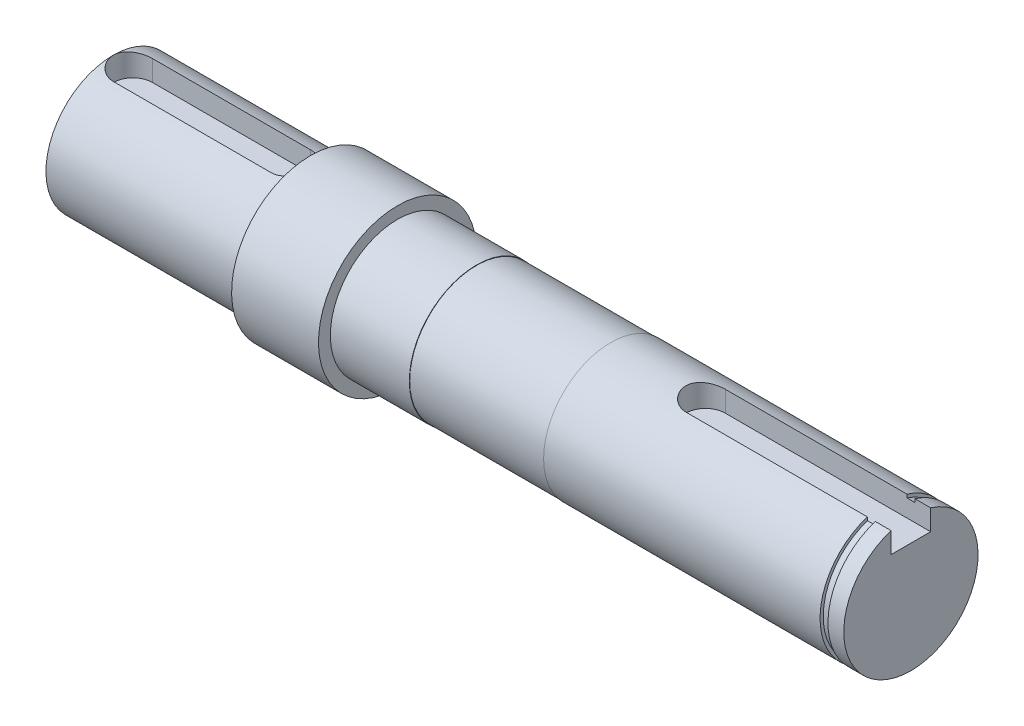
ISO-10303-21;
HEADER;
FILE_DESCRIPTION(('STEP AP214'),'2;1');
FILE_NAME('part.step','',(''),(''),'','','');
FILE_SCHEMA(('AUTOMOTIVE_DESIGN { 1 0 10303 214 1 1 1 1 }'));
ENDSEC;
DATA;
#1=APPLICATION_CONTEXT('core data for automotive mechanical design processes');
#2=APPLICATION_PROTOCOL_DEFINITION('international standard','automotive_design',2000,#1);
#3=PRODUCT_CONTEXT('',#1,'mechanical');
#4=PRODUCT('Part','Part','',(#3));
#5=PRODUCT_RELATED_PRODUCT_CATEGORY('part','',(#4));
#6=PRODUCT_DEFINITION_FORMATION('','',#4);
#7=PRODUCT_DEFINITION_CONTEXT('part definition',#1,'design');
#8=PRODUCT_DEFINITION('design','',#6,#7);
#9=PRODUCT_DEFINITION_SHAPE('','',#8);
#10=(LENGTH_UNIT() NAMED_UNIT(*) SI_UNIT(.MILLI.,.METRE.));
#11=(NAMED_UNIT(*) PLANE_ANGLE_UNIT() SI_UNIT($,.RADIAN.));
#12=(NAMED_UNIT(*) SI_UNIT($,.STERADIAN.) SOLID_ANGLE_UNIT());
#13=UNCERTAINTY_MEASURE_WITH_UNIT(LENGTH_MEASURE(1.E-05),#10,'distance_accuracy_value','');
#14=(GEOMETRIC_REPRESENTATION_CONTEXT(3) GLOBAL_UNCERTAINTY_ASSIGNED_CONTEXT((#13)) GLOBAL_UNIT_ASSIGNED_CONTEXT((#10,
#11,#12)) REPRESENTATION_CONTEXT('',''));
#15=CARTESIAN_POINT('',(0.,0.,0.));
#16=DIRECTION('',(0.,0.,1.));
#17=DIRECTION('',(1.,0.,0.));
#18=AXIS2_PLACEMENT_3D('',#15,#16,#17);
#19=CARTESIAN_POINT('',(101.,0.,0.));
#20=DIRECTION('',(1.,0.,0.));
#21=DIRECTION('',(0.,1.,0.));
#22=AXIS2_PLACEMENT_3D('',#19,#20,#21);
#23=CYLINDRICAL_SURFACE('',#22,8.49999999999998);
#24=CARTESIAN_POINT('',(36.,0.,0.));
#25=DIRECTION('',(1.,0.,0.));
#26=DIRECTION('',(0.,1.,0.));
#27=AXIS2_PLACEMENT_3D('',#24,#25,#26);
#28=CIRCLE('',#27,8.49999999999999);
#29=CARTESIAN_POINT('',(36.,8.49999999999999,0.));
#30=VERTEX_POINT('',#29);
#31=EDGE_CURVE('E277',#30,#30,#28,.T.);
#32=ORIENTED_EDGE('',*,*,#31,.T.);
#33=EDGE_LOOP('',(#32));
#34=FACE_BOUND('',#33,.T.);
#35=CARTESIAN_POINT('',(46.0000000000074,0.,0.));
#36=DIRECTION('',(-1.,0.,0.));
#37=DIRECTION('',(0.,0.,1.));
#38=AXIS2_PLACEMENT_3D('',#35,#36,#37);
#39=CIRCLE('',#38,8.49999999999998);
#40=CARTESIAN_POINT('',(46.0000000000074,0.,8.49999999999998));
#41=VERTEX_POINT('',#40);
#42=EDGE_CURVE('E358',#41,#41,#39,.T.);
#43=ORIENTED_EDGE('',*,*,#42,.T.);
#44=EDGE_LOOP('',(#43));
#45=FACE_BOUND('',#44,.T.);
#46=ADVANCED_FACE('F33',(#34,#45),#23,.T.);
#47=CARTESIAN_POINT('',(0.,0.,0.));
#48=DIRECTION('',(-1.,0.,0.));
#49=DIRECTION('',(0.,-1.,0.));
#50=AXIS2_PLACEMENT_3D('',#47,#48,#49);
#51=PLANE('',#50);
#52=CARTESIAN_POINT('',(0.,0.,0.));
#53=DIRECTION('',(1.,0.,0.));
#54=DIRECTION('',(0.,1.,0.));
#55=AXIS2_PLACEMENT_3D('',#52,#53,#54);
#56=CIRCLE('',#55,8.49999999999999);
#57=CARTESIAN_POINT('',(0.,8.49999999999999,0.));
#58=VERTEX_POINT('',#57);
#59=EDGE_CURVE('E287',#58,#58,#56,.T.);
#60=ORIENTED_EDGE('',*,*,#59,.F.);
#61=EDGE_LOOP('',(#60));
#62=FACE_BOUND('',#61,.T.);
#63=ADVANCED_FACE('F35',(#62),#51,.T.);
#64=CARTESIAN_POINT('',(101.,0.,0.));
#65=DIRECTION('',(1.,0.,0.));
#66=DIRECTION('',(0.,1.,0.));
#67=AXIS2_PLACEMENT_3D('',#64,#65,#66);
#68=CYLINDRICAL_SURFACE('',#67,8.49999999999999);
#69=CARTESIAN_POINT('',(2.51,8.12403840463595,-2.5));
#70=CARTESIAN_POINT('',(2.44132012598351,8.12402906918786,-2.50000849482375));
#71=CARTESIAN_POINT('',(2.37264564496574,8.12490911076692,-2.49717000278527));
#72=CARTESIAN_POINT('',(2.23581945584985,8.12837858671624,-2.48586511968106));
#73=CARTESIAN_POINT('',(2.16766763730745,8.13096764928693,-2.47739995270244));
#74=CARTESIAN_POINT('',(2.03253481475384,8.13777747849976,-2.45493539721691));
#75=CARTESIAN_POINT('',(1.96555134368311,8.14199421689238,-2.44094966934028));
#76=CARTESIAN_POINT('',(1.83307387750925,8.15192355487622,-2.40758038109888));
#77=CARTESIAN_POINT('',(1.76757991899812,8.15763619117327,-2.38819668828));
#78=CARTESIAN_POINT('',(1.57405334228369,8.17677139859333,-2.32218333516284));
#79=CARTESIAN_POINT('',(1.44880885562689,8.19220032894025,-2.26766331260792));
#80=CARTESIAN_POINT('',(1.20924749977114,8.22665400749431,-2.13928827038699));
#81=CARTESIAN_POINT('',(1.09493547462655,8.24568033865687,-2.06542473351158));
#82=CARTESIAN_POINT('',(0.876977246358632,8.28582980304435,-1.89805567552886));
#83=CARTESIAN_POINT('',(0.773708544242656,8.3069960693274,-1.80406793699746));
#84=CARTESIAN_POINT('',(0.58414876913239,8.34867230677749,-1.60015164255654));
#85=CARTESIAN_POINT('',(0.497860541847804,8.36918216745791,-1.49022042007658));
#86=CARTESIAN_POINT('',(0.343070185536935,8.4077250943906,-1.25484557022574));
#87=CARTESIAN_POINT('',(0.274954141378952,8.42570106520509,-1.12913784642324));
#88=CARTESIAN_POINT('',(0.160978008424449,8.45664705558545,-0.867439712870041));
#89=CARTESIAN_POINT('',(0.115112355001258,8.46961832661637,-0.731451883926503));
#90=CARTESIAN_POINT('',(0.0481874024191118,8.48878775104764,-0.45702543604251));
#91=CARTESIAN_POINT('',(0.026479434076655,8.49516267663222,-0.318757581047488));
#92=CARTESIAN_POINT('',(0.00643683305777085,8.50104290465191,-0.0404023337326061));
#93=CARTESIAN_POINT('',(0.00809796422748242,8.50054945212902,0.0996847242177982));
#94=CARTESIAN_POINT('',(0.0343079273842703,8.49287404903276,0.373152065700697));
#95=CARTESIAN_POINT('',(0.0581541875525614,8.48589741931877,0.506606351501286));
#96=CARTESIAN_POINT('',(0.126911871627669,8.46628787386657,0.767526211609399));
#97=CARTESIAN_POINT('',(0.171824383512801,8.45365466599276,0.894991476236481));
#98=CARTESIAN_POINT('',(0.281927116913897,8.4238636719765,1.14201050505989));
#99=CARTESIAN_POINT('',(0.347342099128687,8.40665607251672,1.26145783196649));
#100=CARTESIAN_POINT('',(0.496415594932422,8.36954730631604,1.48790576816497));
#101=CARTESIAN_POINT('',(0.580078038110117,8.34964555974156,1.59490368885599));
#102=CARTESIAN_POINT('',(0.766920813166765,8.30841337666869,1.79760092163623));
#103=CARTESIAN_POINT('',(0.87070899040578,8.28705732485782,1.89273539157049));
#104=CARTESIAN_POINT('',(1.09300405690464,8.24596689824959,2.06442395091057));
#105=CARTESIAN_POINT('',(1.21151517138103,8.22623299169097,2.14097268784054));
#106=CARTESIAN_POINT('',(1.46135178976552,8.19049726651392,2.27388499803613));
#107=CARTESIAN_POINT('',(1.5927874583343,8.17453234339791,2.33005169701786));
#108=CARTESIAN_POINT('',(1.86375726830082,8.14859211524142,2.41922275200858));
#109=CARTESIAN_POINT('',(2.00327871917307,8.13860768891973,2.45226239378342));
#110=CARTESIAN_POINT('',(2.20507757930823,8.12953164409689,2.48209216527632));
#111=CARTESIAN_POINT('',(2.26589533912244,8.12747604590248,2.48880708529662));
#112=CARTESIAN_POINT('',(2.38779853307323,8.12472934803225,2.49775684694221));
#113=CARTESIAN_POINT('',(2.44888342988087,8.12403620932029,2.49999838344215));
#114=CARTESIAN_POINT('',(2.51,8.12403840463595,2.5));
#115=B_SPLINE_CURVE_WITH_KNOTS('',3,(#69,#70,#71,#72,#73,#74,#75,#76,#77,#78,#79,#80,#81,#82,
#83,#84,#85,#86,#87,#88,#89,#90,#91,#92,#93,#94,#95,#96,#97,#98,#99,#100,#101,#102,#103,#104,
#105,#106,#107,#108,#109,#110,#111,#112,#113,#114),.UNSPECIFIED.,.F.,.F.,(4,2,2,2,2,2,2,2,2,2,2,
2,2,2,2,2,2,2,2,2,2,2,4),(0.,0.205966154303658,0.411887515184554,0.617302486138781,
0.822722497965401,1.23305966556148,1.64357781480005,2.0653304967558,2.48715379896953,
2.91733102657664,3.3474006151165,3.76562050724646,4.18376458896797,4.58910158908383,
4.9944595253604,5.40442657694559,5.81448200221468,6.2397161669572,6.66507264934228,
7.09443475825322,7.52314033790765,7.70665727258006,7.88989934885714),.UNSPECIFIED.);
#116=CARTESIAN_POINT('',(2.51,8.12403840463595,-2.5));
#117=VERTEX_POINT('',#116);
#118=CARTESIAN_POINT('',(2.51,8.12403840463596,2.5));
#119=VERTEX_POINT('',#118);
#120=EDGE_CURVE('E142',#117,#119,#115,.T.);
#121=ORIENTED_EDGE('',*,*,#120,.F.);
#122=DIRECTION('',(1.,0.,0.));
#123=VECTOR('',#122,1.);
#124=CARTESIAN_POINT('',(101.,8.12403840463596,-2.50000000000001));
#125=LINE('',#124,#123);
#126=CARTESIAN_POINT('',(22.51,8.12403840463595,-2.5));
#127=VERTEX_POINT('',#126);
#128=EDGE_CURVE('E12',#127,#117,#125,.F.);
#129=ORIENTED_EDGE('',*,*,#128,.F.);
#130=CARTESIAN_POINT('',(25.,8.49706419888657,-0.223383079036948));
#131=CARTESIAN_POINT('',(24.993813347442,8.49525655884987,-0.292435308228331));
#132=CARTESIAN_POINT('',(24.9847409070689,8.49259893892862,-0.361199395677494));
#133=CARTESIAN_POINT('',(24.9609453799739,8.48569265386917,-0.497645530334624));
#134=CARTESIAN_POINT('',(24.9462236431494,8.48144436882577,-0.565327832013578));
#135=CARTESIAN_POINT('',(24.9112875125512,8.47147615101255,-0.698984565839865));
#136=CARTESIAN_POINT('',(24.8910857996503,8.46575961742932,-0.764962560481731));
#137=CARTESIAN_POINT('',(24.8453599091532,8.45301280034375,-0.894898842268685));
#138=CARTESIAN_POINT('',(24.8198355514473,8.44598247238555,-0.958857060983446));
#139=CARTESIAN_POINT('',(24.7355849608704,8.42319910103025,-1.14699950029637));
#140=CARTESIAN_POINT('',(24.6691353557341,8.40573995109053,-1.26762564306889));
#141=CARTESIAN_POINT('',(24.5176481407656,8.3681112680584,-1.49605221867256));
#142=CARTESIAN_POINT('',(24.4326031130196,8.3479406545745,-1.60384750656001));
#143=CARTESIAN_POINT('',(24.2436743792781,8.30643895546526,-1.8066725358398));
#144=CARTESIAN_POINT('',(24.1393573652561,8.28509132530584,-1.901296237207));
#145=CARTESIAN_POINT('',(23.9160815364517,8.24409163636891,-2.07187764207679));
#146=CARTESIAN_POINT('',(23.7971181555461,8.22444010962984,-2.14782950225405));
#147=CARTESIAN_POINT('',(23.5465418299409,8.18895060432059,-2.27942765429356));
#148=CARTESIAN_POINT('',(23.4148263351885,8.17314788281347,-2.33488845959448));
#149=CARTESIAN_POINT('',(23.1434328092201,8.14758251983388,-2.42260657469438));
#150=CARTESIAN_POINT('',(23.0037678986843,8.13781022366502,-2.45490098737235));
#151=CARTESIAN_POINT('',(22.8040241883731,8.12914567218984,-2.48335360976332));
#152=CARTESIAN_POINT('',(22.7453656804734,8.12723415571825,-2.489595839628));
#153=CARTESIAN_POINT('',(22.6278145030744,8.12468069216272,-2.49791494108419));
#154=CARTESIAN_POINT('',(22.5689223128896,8.12403685709001,-2.49999800708497));
#155=CARTESIAN_POINT('',(22.51,8.12403840463596,-2.5));
#156=B_SPLINE_CURVE_WITH_KNOTS('',3,(#130,#131,#132,#133,#134,#135,#136,#137,#138,#139,#140,
#141,#142,#143,#144,#145,#146,#147,#148,#149,#150,#151,#152,#153,#154,#155),.UNSPECIFIED.,.F.,
.F.,(4,2,2,2,2,2,2,2,2,2,2,2,4),(0.,0.207980442842485,0.415911219741289,0.623364882068589,
0.830825565434457,1.24521191947858,1.65976387925486,2.08512275114555,2.51061456949985,
2.93986871891648,3.36843383829658,3.54536451057105,3.72203147576733),.UNSPECIFIED.);
#157=CARTESIAN_POINT('',(25.,8.49706419888657,-0.223383079036861));
#158=VERTEX_POINT('',#157);
#159=EDGE_CURVE('E169',#158,#127,#156,.T.);
#160=ORIENTED_EDGE('',*,*,#159,.F.);
#161=CARTESIAN_POINT('',(25.,0.,0.));
#162=DIRECTION('',(1.,0.,0.));
#163=DIRECTION('',(0.,1.,0.));
#164=AXIS2_PLACEMENT_3D('',#161,#162,#163);
#165=CIRCLE('',#164,8.49999999999999);
#166=CARTESIAN_POINT('',(25.,8.49706419888657,0.223383079036856));
#167=VERTEX_POINT('',#166);
#168=EDGE_CURVE('E218',#167,#158,#165,.T.);
#169=ORIENTED_EDGE('',*,*,#168,.F.);
#170=CARTESIAN_POINT('',(22.51,8.12403840463595,2.5));
#171=CARTESIAN_POINT('',(22.5786805370385,8.12402906877925,2.50000849609303));
#172=CARTESIAN_POINT('',(22.6473556816249,8.12490912756119,2.49716994858));
#173=CARTESIAN_POINT('',(22.7841831821002,8.12837867030531,2.48586484646458));
#174=CARTESIAN_POINT('',(22.8523356484438,8.13096778243671,2.47739951605241));
#175=CARTESIAN_POINT('',(22.9874684336137,8.13777767460837,2.45493474787382));
#176=CARTESIAN_POINT('',(23.0544512388449,8.1419943948615,2.44094907769413));
#177=CARTESIAN_POINT('',(23.1869273947816,8.15192366586084,2.40758000169047));
#178=CARTESIAN_POINT('',(23.2524207089904,8.15763625321725,2.38819646375707));
#179=CARTESIAN_POINT('',(23.4459484121886,8.17677157216759,2.32218275729729));
#180=CARTESIAN_POINT('',(23.5711945448026,8.19220074873478,2.26766194343456));
#181=CARTESIAN_POINT('',(23.8107556482421,8.22665452984702,2.13928612954425));
#182=CARTESIAN_POINT('',(23.9250660743792,8.24568061951481,2.06542313849218));
#183=CARTESIAN_POINT('',(24.1430105207039,8.28582755425194,1.89806548574551));
#184=CARTESIAN_POINT('',(24.2462684264297,8.30699137209334,1.80409043225915));
#185=CARTESIAN_POINT('',(24.4358324309312,8.34866780739879,1.60017414536475));
#186=CARTESIAN_POINT('',(24.5221319466521,8.36918016939478,1.49022674036273));
#187=CARTESIAN_POINT('',(24.6769787262261,8.4077374037511,1.2547764003125));
#188=CARTESIAN_POINT('',(24.7451291516515,8.42572359267612,1.12900252450636));
#189=CARTESIAN_POINT('',(24.8590846344064,8.45666415648478,0.867239980267896));
#190=CARTESIAN_POINT('',(24.9049236042065,8.46962616176902,0.731267179157219));
#191=CARTESIAN_POINT('',(24.9536019427315,8.48357271826782,0.531714661116634));
#192=CARTESIAN_POINT('',(24.9661135931956,8.48718990766301,0.47054182860288));
#193=CARTESIAN_POINT('',(24.9865199928087,8.49311851353699,0.347459353113864));
#194=CARTESIAN_POINT('',(24.9944213608226,8.49543180183031,0.285550897290376));
#195=CARTESIAN_POINT('',(25.,8.49706419888657,0.223383079036943));
#196=B_SPLINE_CURVE_WITH_KNOTS('',3,(#170,#171,#172,#173,#174,#175,#176,#177,#178,#179,#180,
#181,#182,#183,#184,#185,#186,#187,#188,#189,#190,#191,#192,#193,#194,#195),.UNSPECIFIED.,.F.,
.F.,(4,2,2,2,2,2,2,2,2,2,2,2,4),(0.,0.205968142667953,0.411891488567575,0.617304479325872,
0.822722497880503,1.23306525748042,1.64357781423138,2.06528411602704,2.48715379744468,
2.91760538291471,3.34740064100109,3.53487536146799,3.72208026275678),.UNSPECIFIED.);
#197=CARTESIAN_POINT('',(22.51,8.12403840463596,2.5));
#198=VERTEX_POINT('',#197);
#199=EDGE_CURVE('E179',#198,#167,#196,.T.);
#200=ORIENTED_EDGE('',*,*,#199,.F.);
#201=DIRECTION('',(1.,0.,0.));
#202=VECTOR('',#201,1.);
#203=CARTESIAN_POINT('',(101.,8.12403840463597,2.49999999999999));
#204=LINE('',#203,#202);
#205=EDGE_CURVE('E41',#119,#198,#204,.T.);
#206=ORIENTED_EDGE('',*,*,#205,.F.);
#207=EDGE_LOOP('',(#121,#129,#160,#169,#200,#206));
#208=FACE_BOUND('',#207,.T.);
#209=ORIENTED_EDGE('',*,*,#59,.T.);
#210=EDGE_LOOP('',(#209));
#211=FACE_BOUND('',#210,.T.);
#212=ADVANCED_FACE('F184',(#208,#211),#68,.T.);
#213=CARTESIAN_POINT('',(25.,9.99999999999999,0.));
#214=DIRECTION('',(-1.,0.,0.));
#215=DIRECTION('',(0.,-1.,0.));
#216=AXIS2_PLACEMENT_3D('',#213,#214,#215);
#217=PLANE('',#216);
#218=DIRECTION('',(0.,1.,0.));
#219=VECTOR('',#218,1.);
#220=CARTESIAN_POINT('',(25.,5.5,0.223383079036856));
#221=LINE('',#220,#219);
#222=CARTESIAN_POINT('',(25.,8.5,0.223383079036856));
#223=VERTEX_POINT('',#222);
#224=EDGE_CURVE('E209',#167,#223,#221,.T.);
#225=ORIENTED_EDGE('',*,*,#224,.F.);
#226=ORIENTED_EDGE('',*,*,#168,.T.);
#227=DIRECTION('',(0.,1.,0.));
#228=VECTOR('',#227,1.);
#229=CARTESIAN_POINT('',(25.,5.5,-0.223383079036861));
#230=LINE('',#229,#228);
#231=CARTESIAN_POINT('',(25.,8.5,-0.223383079036861));
#232=VERTEX_POINT('',#231);
#233=EDGE_CURVE('E480',#232,#158,#230,.F.);
#234=ORIENTED_EDGE('',*,*,#233,.F.);
#235=DIRECTION('',(0.,0.,1.));
#236=VECTOR('',#235,1.);
#237=CARTESIAN_POINT('',(25.,8.5,0.));
#238=LINE('',#237,#236);
#239=EDGE_CURVE('E305',#232,#223,#238,.T.);
#240=ORIENTED_EDGE('',*,*,#239,.T.);
#241=EDGE_LOOP('',(#225,#226,#234,#240));
#242=FACE_BOUND('',#241,.T.);
#243=CARTESIAN_POINT('',(25.,0.,0.));
#244=DIRECTION('',(1.,0.,0.));
#245=DIRECTION('',(0.,1.,0.));
#246=AXIS2_PLACEMENT_3D('',#243,#244,#245);
#247=CIRCLE('',#246,9.99999999999998);
#248=CARTESIAN_POINT('',(25.,9.99999999999999,0.));
#249=VERTEX_POINT('',#248);
#250=EDGE_CURVE('E283',#249,#249,#247,.T.);
#251=ORIENTED_EDGE('',*,*,#250,.F.);
#252=EDGE_LOOP('',(#251));
#253=FACE_BOUND('',#252,.T.);
#254=ADVANCED_FACE('F435',(#242,#253),#217,.T.);
#255=CARTESIAN_POINT('',(101.,0.,0.));
#256=DIRECTION('',(1.,0.,0.));
#257=DIRECTION('',(0.,1.,0.));
#258=AXIS2_PLACEMENT_3D('',#255,#256,#257);
#259=CYLINDRICAL_SURFACE('',#258,9.99999999999998);
#260=ORIENTED_EDGE('',*,*,#250,.T.);
#261=EDGE_LOOP('',(#260));
#262=FACE_BOUND('',#261,.T.);
#263=CARTESIAN_POINT('',(36.,0.,0.));
#264=DIRECTION('',(1.,0.,0.));
#265=DIRECTION('',(0.,1.,0.));
#266=AXIS2_PLACEMENT_3D('',#263,#264,#265);
#267=CIRCLE('',#266,9.99999999999998);
#268=CARTESIAN_POINT('',(36.,9.99999999999999,0.));
#269=VERTEX_POINT('',#268);
#270=EDGE_CURVE('E280',#269,#269,#267,.T.);
#271=ORIENTED_EDGE('',*,*,#270,.F.);
#272=EDGE_LOOP('',(#271));
#273=FACE_BOUND('',#272,.T.);
#274=ADVANCED_FACE('F444',(#262,#273),#259,.T.);
#275=CARTESIAN_POINT('',(36.,9.99999999999999,0.));
#276=DIRECTION('',(1.,0.,0.));
#277=DIRECTION('',(0.,1.,0.));
#278=AXIS2_PLACEMENT_3D('',#275,#276,#277);
#279=PLANE('',#278);
#280=ORIENTED_EDGE('',*,*,#270,.T.);
#281=EDGE_LOOP('',(#280));
#282=FACE_BOUND('',#281,.T.);
#283=ORIENTED_EDGE('',*,*,#31,.F.);
#284=EDGE_LOOP('',(#283));
#285=FACE_BOUND('',#284,.T.);
#286=ADVANCED_FACE('F201',(#282,#285),#279,.T.);
#287=CARTESIAN_POINT('',(2.51,5.5,0.));
#288=DIRECTION('',(0.,1.,0.));
#289=DIRECTION('',(0.,0.,1.));
#290=AXIS2_PLACEMENT_3D('',#287,#288,#289);
#291=CYLINDRICAL_SURFACE('',#290,2.5);
#292=DIRECTION('',(0.,1.,0.));
#293=VECTOR('',#292,1.);
#294=CARTESIAN_POINT('',(2.51,5.5,-2.5));
#295=LINE('',#294,#293);
#296=CARTESIAN_POINT('',(2.51,5.5,-2.5));
#297=VERTEX_POINT('',#296);
#298=EDGE_CURVE('E167',#297,#117,#295,.T.);
#299=ORIENTED_EDGE('',*,*,#298,.T.);
#300=ORIENTED_EDGE('',*,*,#120,.T.);
#301=DIRECTION('',(0.,1.,0.));
#302=VECTOR('',#301,1.);
#303=CARTESIAN_POINT('',(2.51,5.5,2.5));
#304=LINE('',#303,#302);
#305=CARTESIAN_POINT('',(2.51,5.5,2.5));
#306=VERTEX_POINT('',#305);
#307=EDGE_CURVE('E135',#306,#119,#304,.T.);
#308=ORIENTED_EDGE('',*,*,#307,.F.);
#309=CARTESIAN_POINT('',(2.51,5.5,0.));
#310=DIRECTION('',(0.,1.,0.));
#311=DIRECTION('',(0.,0.,-1.));
#312=AXIS2_PLACEMENT_3D('',#309,#310,#311);
#313=CIRCLE('',#312,2.5);
#314=EDGE_CURVE('E140',#297,#306,#313,.T.);
#315=ORIENTED_EDGE('',*,*,#314,.F.);
#316=EDGE_LOOP('',(#299,#300,#308,#315));
#317=FACE_BOUND('',#316,.T.);
#318=ADVANCED_FACE('F138',(#317),#291,.F.);
#319=CARTESIAN_POINT('',(2.51,5.5,-2.5));
#320=DIRECTION('',(0.,0.,-1.));
#321=DIRECTION('',(-1.,0.,0.));
#322=AXIS2_PLACEMENT_3D('',#319,#320,#321);
#323=PLANE('',#322);
#324=ORIENTED_EDGE('',*,*,#128,.T.);
#325=ORIENTED_EDGE('',*,*,#298,.F.);
#326=DIRECTION('',(-1.,0.,0.));
#327=VECTOR('',#326,1.);
#328=CARTESIAN_POINT('',(2.51,5.5,-2.5));
#329=LINE('',#328,#327);
#330=CARTESIAN_POINT('',(22.51,5.5,-2.5));
#331=VERTEX_POINT('',#330);
#332=EDGE_CURVE('E146',#331,#297,#329,.T.);
#333=ORIENTED_EDGE('',*,*,#332,.F.);
#334=DIRECTION('',(0.,1.,0.));
#335=VECTOR('',#334,1.);
#336=CARTESIAN_POINT('',(22.51,5.5,-2.5));
#337=LINE('',#336,#335);
#338=EDGE_CURVE('E170',#331,#127,#337,.T.);
#339=ORIENTED_EDGE('',*,*,#338,.T.);
#340=EDGE_LOOP('',(#324,#325,#333,#339));
#341=FACE_BOUND('',#340,.T.);
#342=ADVANCED_FACE('F192',(#341),#323,.F.);
#343=CARTESIAN_POINT('',(22.51,5.5,0.));
#344=DIRECTION('',(0.,1.,0.));
#345=DIRECTION('',(0.,0.,1.));
#346=AXIS2_PLACEMENT_3D('',#343,#344,#345);
#347=CYLINDRICAL_SURFACE('',#346,2.5);
#348=ORIENTED_EDGE('',*,*,#199,.T.);
#349=ORIENTED_EDGE('',*,*,#224,.T.);
#350=CARTESIAN_POINT('',(22.51,8.5,0.));
#351=DIRECTION('',(0.,1.,0.));
#352=DIRECTION('',(0.,0.,1.));
#353=AXIS2_PLACEMENT_3D('',#350,#351,#352);
#354=CIRCLE('',#353,2.5);
#355=EDGE_CURVE('E47',#223,#232,#354,.T.);
#356=ORIENTED_EDGE('',*,*,#355,.T.);
#357=ORIENTED_EDGE('',*,*,#233,.T.);
#358=ORIENTED_EDGE('',*,*,#159,.T.);
#359=ORIENTED_EDGE('',*,*,#338,.F.);
#360=CARTESIAN_POINT('',(22.51,5.5,0.));
#361=DIRECTION('',(0.,1.,0.));
#362=DIRECTION('',(0.,0.,1.));
#363=AXIS2_PLACEMENT_3D('',#360,#361,#362);
#364=CIRCLE('',#363,2.5);
#365=CARTESIAN_POINT('',(22.51,5.5,2.5));
#366=VERTEX_POINT('',#365);
#367=EDGE_CURVE('E155',#366,#331,#364,.T.);
#368=ORIENTED_EDGE('',*,*,#367,.F.);
#369=DIRECTION('',(0.,1.,0.));
#370=VECTOR('',#369,1.);
#371=CARTESIAN_POINT('',(22.51,5.5,2.5));
#372=LINE('',#371,#370);
#373=EDGE_CURVE('E145',#366,#198,#372,.T.);
#374=ORIENTED_EDGE('',*,*,#373,.T.);
#375=EDGE_LOOP('',(#348,#349,#356,#357,#358,#359,#368,#374));
#376=FACE_BOUND('',#375,.T.);
#377=ADVANCED_FACE('F187',(#376),#347,.F.);
#378=CARTESIAN_POINT('',(2.51,5.5,2.5));
#379=DIRECTION('',(0.,0.,1.));
#380=DIRECTION('',(1.,0.,0.));
#381=AXIS2_PLACEMENT_3D('',#378,#379,#380);
#382=PLANE('',#381);
#383=ORIENTED_EDGE('',*,*,#205,.T.);
#384=ORIENTED_EDGE('',*,*,#373,.F.);
#385=DIRECTION('',(1.,0.,0.));
#386=VECTOR('',#385,1.);
#387=CARTESIAN_POINT('',(2.51,5.5,2.5));
#388=LINE('',#387,#386);
#389=EDGE_CURVE('E149',#306,#366,#388,.T.);
#390=ORIENTED_EDGE('',*,*,#389,.F.);
#391=ORIENTED_EDGE('',*,*,#307,.T.);
#392=EDGE_LOOP('',(#383,#384,#390,#391));
#393=FACE_BOUND('',#392,.T.);
#394=ADVANCED_FACE('F150',(#393),#382,.F.);
#395=CARTESIAN_POINT('',(2.51,5.5,0.));
#396=DIRECTION('',(0.,-1.,0.));
#397=DIRECTION('',(0.,0.,-1.));
#398=AXIS2_PLACEMENT_3D('',#395,#396,#397);
#399=PLANE('',#398);
#400=ORIENTED_EDGE('',*,*,#314,.T.);
#401=ORIENTED_EDGE('',*,*,#389,.T.);
#402=ORIENTED_EDGE('',*,*,#367,.T.);
#403=ORIENTED_EDGE('',*,*,#332,.T.);
#404=EDGE_LOOP('',(#400,#401,#402,#403));
#405=FACE_BOUND('',#404,.T.);
#406=ADVANCED_FACE('F157',(#405),#399,.F.);
#407=CARTESIAN_POINT('',(2.51,8.5,0.));
#408=DIRECTION('',(0.,-1.,0.));
#409=DIRECTION('',(0.,0.,-1.));
#410=AXIS2_PLACEMENT_3D('',#407,#408,#409);
#411=PLANE('',#410);
#412=ORIENTED_EDGE('',*,*,#355,.F.);
#413=ORIENTED_EDGE('',*,*,#239,.F.);
#414=EDGE_LOOP('',(#412,#413));
#415=FACE_BOUND('',#414,.T.);
#416=ADVANCED_FACE('F368',(#415),#411,.T.);
#417=CARTESIAN_POINT('',(46.0000000000074,0.,-8.49999999999998));
#418=DIRECTION('',(1.,0.,0.));
#419=DIRECTION('',(0.,0.,-1.));
#420=AXIS2_PLACEMENT_3D('',#417,#418,#419);
#421=PLANE('',#420);
#422=CARTESIAN_POINT('',(46.0000000000074,0.,0.));
#423=DIRECTION('',(-1.,0.,0.));
#424=DIRECTION('',(0.,0.,1.));
#425=AXIS2_PLACEMENT_3D('',#422,#423,#424);
#426=CIRCLE('',#425,8.45);
#427=CARTESIAN_POINT('',(46.0000000000074,0.,8.45));
#428=VERTEX_POINT('',#427);
#429=EDGE_CURVE('E160',#428,#428,#426,.T.);
#430=ORIENTED_EDGE('',*,*,#429,.T.);
#431=EDGE_LOOP('',(#430));
#432=FACE_BOUND('',#431,.T.);
#433=ORIENTED_EDGE('',*,*,#42,.F.);
#434=EDGE_LOOP('',(#433));
#435=FACE_BOUND('',#434,.T.);
#436=ADVANCED_FACE('F365',(#432,#435),#421,.T.);
#437=CARTESIAN_POINT('',(48.8761416872571,0.,0.));
#438=DIRECTION('',(-1.,0.,0.));
#439=DIRECTION('',(0.,0.,1.));
#440=AXIS2_PLACEMENT_3D('',#437,#438,#439);
#441=CYLINDRICAL_SURFACE('',#440,8.45);
#442=CARTESIAN_POINT('',(63.0000000000077,0.,0.));
#443=DIRECTION('',(-1.,0.,0.));
#444=DIRECTION('',(0.,0.,1.));
#445=AXIS2_PLACEMENT_3D('',#442,#443,#444);
#446=CIRCLE('',#445,8.45);
#447=CARTESIAN_POINT('',(63.0000000000077,0.,8.45));
#448=VERTEX_POINT('',#447);
#449=EDGE_CURVE('E357',#448,#448,#446,.T.);
#450=ORIENTED_EDGE('',*,*,#449,.T.);
#451=EDGE_LOOP('',(#450));
#452=FACE_BOUND('',#451,.T.);
#453=ORIENTED_EDGE('',*,*,#429,.F.);
#454=EDGE_LOOP('',(#453));
#455=FACE_BOUND('',#454,.T.);
#456=ADVANCED_FACE('F367',(#452,#455),#441,.T.);
#457=CARTESIAN_POINT('',(63.0000000000077,0.,-8.49999999999998));
#458=DIRECTION('',(-1.,0.,0.));
#459=DIRECTION('',(0.,0.,1.));
#460=AXIS2_PLACEMENT_3D('',#457,#458,#459);
#461=PLANE('',#460);
#462=CARTESIAN_POINT('',(63.0000000000077,0.,0.));
#463=DIRECTION('',(-1.,0.,0.));
#464=DIRECTION('',(0.,0.,1.));
#465=AXIS2_PLACEMENT_3D('',#462,#463,#464);
#466=CIRCLE('',#465,8.49999999999998);
#467=CARTESIAN_POINT('',(63.0000000000077,0.,8.49999999999998));
#468=VERTEX_POINT('',#467);
#469=EDGE_CURVE('E355',#468,#468,#466,.T.);
#470=ORIENTED_EDGE('',*,*,#469,.T.);
#471=EDGE_LOOP('',(#470));
#472=FACE_BOUND('',#471,.T.);
#473=ORIENTED_EDGE('',*,*,#449,.F.);
#474=EDGE_LOOP('',(#473));
#475=FACE_BOUND('',#474,.T.);
#476=ADVANCED_FACE('F338',(#472,#475),#461,.T.);
#477=CARTESIAN_POINT('',(75.,5.5,0.));
#478=DIRECTION('',(0.,-1.,0.));
#479=DIRECTION('',(0.,0.,-1.));
#480=AXIS2_PLACEMENT_3D('',#477,#478,#479);
#481=PLANE('',#480);
#482=DIRECTION('',(0.,0.,-1.));
#483=VECTOR('',#482,1.);
#484=CARTESIAN_POINT('',(101.,5.5,0.));
#485=LINE('',#484,#483);
#486=CARTESIAN_POINT('',(101.,5.5,2.5));
#487=VERTEX_POINT('',#486);
#488=CARTESIAN_POINT('',(101.,5.5,-2.5));
#489=VERTEX_POINT('',#488);
#490=EDGE_CURVE('E295',#487,#489,#485,.T.);
#491=ORIENTED_EDGE('',*,*,#490,.T.);
#492=DIRECTION('',(-1.,0.,0.));
#493=VECTOR('',#492,1.);
#494=CARTESIAN_POINT('',(75.,5.5,-2.5));
#495=LINE('',#494,#493);
#496=CARTESIAN_POINT('',(75.,5.5,-2.5));
#497=VERTEX_POINT('',#496);
#498=EDGE_CURVE('E226',#489,#497,#495,.T.);
#499=ORIENTED_EDGE('',*,*,#498,.T.);
#500=CARTESIAN_POINT('',(75.,5.5,0.));
#501=DIRECTION('',(0.,1.,0.));
#502=DIRECTION('',(0.,0.,-1.));
#503=AXIS2_PLACEMENT_3D('',#500,#501,#502);
#504=CIRCLE('',#503,2.5);
#505=CARTESIAN_POINT('',(75.,5.5,2.5));
#506=VERTEX_POINT('',#505);
#507=EDGE_CURVE('E219',#497,#506,#504,.T.);
#508=ORIENTED_EDGE('',*,*,#507,.T.);
#509=DIRECTION('',(1.,0.,0.));
#510=VECTOR('',#509,1.);
#511=CARTESIAN_POINT('',(75.,5.5,2.5));
#512=LINE('',#511,#510);
#513=EDGE_CURVE('E221',#506,#487,#512,.T.);
#514=ORIENTED_EDGE('',*,*,#513,.T.);
#515=EDGE_LOOP('',(#491,#499,#508,#514));
#516=FACE_BOUND('',#515,.T.);
#517=ADVANCED_FACE('F202',(#516),#481,.F.);
#518=CARTESIAN_POINT('',(101.,8.49999999999999,0.));
#519=DIRECTION('',(1.,0.,0.));
#520=DIRECTION('',(0.,1.,0.));
#521=AXIS2_PLACEMENT_3D('',#518,#519,#520);
#522=PLANE('',#521);
#523=ORIENTED_EDGE('',*,*,#490,.F.);
#524=DIRECTION('',(0.,1.,0.));
#525=VECTOR('',#524,1.);
#526=CARTESIAN_POINT('',(101.,8.49999999999999,2.5));
#527=LINE('',#526,#525);
#528=CARTESIAN_POINT('',(101.,8.12403840463596,2.5));
#529=VERTEX_POINT('',#528);
#530=EDGE_CURVE('E247',#487,#529,#527,.T.);
#531=ORIENTED_EDGE('',*,*,#530,.T.);
#532=CARTESIAN_POINT('',(101.,0.,0.));
#533=DIRECTION('',(1.,0.,0.));
#534=DIRECTION('',(0.,1.,0.));
#535=AXIS2_PLACEMENT_3D('',#532,#533,#534);
#536=CIRCLE('',#535,8.49999999999998);
#537=CARTESIAN_POINT('',(101.,8.12403840463595,-2.5));
#538=VERTEX_POINT('',#537);
#539=EDGE_CURVE('E274',#529,#538,#536,.T.);
#540=ORIENTED_EDGE('',*,*,#539,.T.);
#541=DIRECTION('',(0.,-1.,0.));
#542=VECTOR('',#541,1.);
#543=CARTESIAN_POINT('',(101.,8.49999999999999,-2.5));
#544=LINE('',#543,#542);
#545=EDGE_CURVE('E55',#538,#489,#544,.T.);
#546=ORIENTED_EDGE('',*,*,#545,.T.);
#547=EDGE_LOOP('',(#523,#531,#540,#546));
#548=FACE_BOUND('',#547,.T.);
#549=ADVANCED_FACE('F330',(#548),#522,.T.);
#550=ORIENTED_EDGE('',*,*,#539,.F.);
#551=DIRECTION('',(1.,0.,0.));
#552=VECTOR('',#551,1.);
#553=CARTESIAN_POINT('',(101.,8.12403840463596,2.5));
#554=LINE('',#553,#552);
#555=CARTESIAN_POINT('',(99.,8.12403840463596,2.5));
#556=VERTEX_POINT('',#555);
#557=EDGE_CURVE('E292',#529,#556,#554,.F.);
#558=ORIENTED_EDGE('',*,*,#557,.T.);
#559=CARTESIAN_POINT('',(99.,0.,0.));
#560=DIRECTION('',(-1.,0.,0.));
#561=DIRECTION('',(0.,0.,1.));
#562=AXIS2_PLACEMENT_3D('',#559,#560,#561);
#563=CIRCLE('',#562,8.5);
#564=CARTESIAN_POINT('',(99.,8.12403840463596,-2.5));
#565=VERTEX_POINT('',#564);
#566=EDGE_CURVE('E265',#565,#556,#563,.T.);
#567=ORIENTED_EDGE('',*,*,#566,.F.);
#568=DIRECTION('',(1.,0.,0.));
#569=VECTOR('',#568,1.);
#570=CARTESIAN_POINT('',(101.,8.12403840463596,-2.5));
#571=LINE('',#570,#569);
#572=EDGE_CURVE('E290',#565,#538,#571,.T.);
#573=ORIENTED_EDGE('',*,*,#572,.T.);
#574=EDGE_LOOP('',(#550,#558,#567,#573));
#575=FACE_BOUND('',#574,.T.);
#576=ADVANCED_FACE('F321',(#575),#23,.T.);
#577=CARTESIAN_POINT('',(99.,8.5,0.));
#578=DIRECTION('',(-1.,0.,0.));
#579=DIRECTION('',(0.,0.,1.));
#580=AXIS2_PLACEMENT_3D('',#577,#578,#579);
#581=PLANE('',#580);
#582=ORIENTED_EDGE('',*,*,#566,.T.);
#583=DIRECTION('',(0.,-1.,0.));
#584=VECTOR('',#583,1.);
#585=CARTESIAN_POINT('',(99.,8.5,2.5));
#586=LINE('',#585,#584);
#587=CARTESIAN_POINT('',(99.,7.70454411370329,2.5));
#588=VERTEX_POINT('',#587);
#589=EDGE_CURVE('E250',#556,#588,#586,.T.);
#590=ORIENTED_EDGE('',*,*,#589,.T.);
#591=CARTESIAN_POINT('',(99.,0.,0.));
#592=DIRECTION('',(-1.,0.,0.));
#593=DIRECTION('',(0.,0.,1.));
#594=AXIS2_PLACEMENT_3D('',#591,#592,#593);
#595=CIRCLE('',#594,8.1);
#596=CARTESIAN_POINT('',(99.,7.70454411370329,-2.5));
#597=VERTEX_POINT('',#596);
#598=EDGE_CURVE('E268',#597,#588,#595,.T.);
#599=ORIENTED_EDGE('',*,*,#598,.F.);
#600=DIRECTION('',(0.,1.,0.));
#601=VECTOR('',#600,1.);
#602=CARTESIAN_POINT('',(99.,8.5,-2.5));
#603=LINE('',#602,#601);
#604=EDGE_CURVE('E235',#597,#565,#603,.T.);
#605=ORIENTED_EDGE('',*,*,#604,.T.);
#606=EDGE_LOOP('',(#582,#590,#599,#605));
#607=FACE_BOUND('',#606,.T.);
#608=ADVANCED_FACE('F317',(#607),#581,.T.);
#609=CARTESIAN_POINT('',(0.,0.,0.));
#610=DIRECTION('',(-1.,0.,0.));
#611=DIRECTION('',(0.,0.,1.));
#612=AXIS2_PLACEMENT_3D('',#609,#610,#611);
#613=CYLINDRICAL_SURFACE('',#612,8.1);
#614=ORIENTED_EDGE('',*,*,#598,.T.);
#615=DIRECTION('',(-1.,0.,0.));
#616=VECTOR('',#615,1.);
#617=CARTESIAN_POINT('',(0.,7.70454411370329,2.5));
#618=LINE('',#617,#616);
#619=CARTESIAN_POINT('',(98.,7.70454411370329,2.5));
#620=VERTEX_POINT('',#619);
#621=EDGE_CURVE('E253',#588,#620,#618,.T.);
#622=ORIENTED_EDGE('',*,*,#621,.T.);
#623=CARTESIAN_POINT('',(98.,0.,0.));
#624=DIRECTION('',(-1.,0.,0.));
#625=DIRECTION('',(0.,0.,1.));
#626=AXIS2_PLACEMENT_3D('',#623,#624,#625);
#627=CIRCLE('',#626,8.1);
#628=CARTESIAN_POINT('',(98.,7.70454411370329,-2.5));
#629=VERTEX_POINT('',#628);
#630=EDGE_CURVE('E271',#629,#620,#627,.T.);
#631=ORIENTED_EDGE('',*,*,#630,.F.);
#632=DIRECTION('',(-1.,0.,0.));
#633=VECTOR('',#632,1.);
#634=CARTESIAN_POINT('',(0.,7.70454411370329,-2.5));
#635=LINE('',#634,#633);
#636=EDGE_CURVE('E238',#629,#597,#635,.F.);
#637=ORIENTED_EDGE('',*,*,#636,.T.);
#638=EDGE_LOOP('',(#614,#622,#631,#637));
#639=FACE_BOUND('',#638,.T.);
#640=ADVANCED_FACE('F320',(#639),#613,.T.);
#641=CARTESIAN_POINT('',(75.,9.99999999999999,-2.5));
#642=DIRECTION('',(0.,0.,1.));
#643=DIRECTION('',(0.,-1.,0.));
#644=AXIS2_PLACEMENT_3D('',#641,#642,#643);
#645=PLANE('',#644);
#646=DIRECTION('',(0.,-1.,0.));
#647=VECTOR('',#646,1.);
#648=CARTESIAN_POINT('',(75.,9.99999999999999,-2.5));
#649=LINE('',#648,#647);
#650=CARTESIAN_POINT('',(75.,8.12403840463595,-2.5));
#651=VERTEX_POINT('',#650);
#652=EDGE_CURVE('E230',#651,#497,#649,.T.);
#653=ORIENTED_EDGE('',*,*,#652,.T.);
#654=ORIENTED_EDGE('',*,*,#498,.F.);
#655=ORIENTED_EDGE('',*,*,#545,.F.);
#656=ORIENTED_EDGE('',*,*,#572,.F.);
#657=ORIENTED_EDGE('',*,*,#604,.F.);
#658=ORIENTED_EDGE('',*,*,#636,.F.);
#659=DIRECTION('',(0.,-1.,0.));
#660=VECTOR('',#659,1.);
#661=CARTESIAN_POINT('',(98.,8.5,-2.5));
#662=LINE('',#661,#660);
#663=CARTESIAN_POINT('',(98.,8.12403840463596,-2.5));
#664=VERTEX_POINT('',#663);
#665=EDGE_CURVE('E241',#664,#629,#662,.T.);
#666=ORIENTED_EDGE('',*,*,#665,.F.);
#667=DIRECTION('',(1.,0.,0.));
#668=VECTOR('',#667,1.);
#669=CARTESIAN_POINT('',(101.,8.12403840463596,-2.5));
#670=LINE('',#669,#668);
#671=EDGE_CURVE('E244',#651,#664,#670,.T.);
#672=ORIENTED_EDGE('',*,*,#671,.F.);
#673=EDGE_LOOP('',(#653,#654,#655,#656,#657,#658,#666,#672));
#674=FACE_BOUND('',#673,.T.);
#675=ADVANCED_FACE('F315',(#674),#645,.T.);
#676=CARTESIAN_POINT('',(75.,9.99999999999999,0.));
#677=DIRECTION('',(0.,-1.,0.));
#678=DIRECTION('',(0.,0.,-1.));
#679=AXIS2_PLACEMENT_3D('',#676,#677,#678);
#680=CYLINDRICAL_SURFACE('',#679,2.5);
#681=DIRECTION('',(0.,-1.,0.));
#682=VECTOR('',#681,1.);
#683=CARTESIAN_POINT('',(75.,9.99999999999999,2.5));
#684=LINE('',#683,#682);
#685=CARTESIAN_POINT('',(75.,8.12403840463595,2.5));
#686=VERTEX_POINT('',#685);
#687=EDGE_CURVE('E232',#686,#506,#684,.T.);
#688=ORIENTED_EDGE('',*,*,#687,.T.);
#689=ORIENTED_EDGE('',*,*,#507,.F.);
#690=ORIENTED_EDGE('',*,*,#652,.F.);
#691=CARTESIAN_POINT('',(75.,8.12403840463595,2.5));
#692=CARTESIAN_POINT('',(74.9313201259835,8.12402906918786,2.50000849482375));
#693=CARTESIAN_POINT('',(74.8626456449657,8.12490911076692,2.49717000278527));
#694=CARTESIAN_POINT('',(74.7258194558499,8.12837858671624,2.48586511968106));
#695=CARTESIAN_POINT('',(74.6576676373075,8.13096764928693,2.47739995270244));
#696=CARTESIAN_POINT('',(74.5225348147539,8.13777747849976,2.45493539721691));
#697=CARTESIAN_POINT('',(74.4555513436831,8.14199421689238,2.44094966934028));
#698=CARTESIAN_POINT('',(74.3230738775093,8.15192355487622,2.40758038109888));
#699=CARTESIAN_POINT('',(74.2575799189981,8.15763619117327,2.38819668828));
#700=CARTESIAN_POINT('',(74.0640533422837,8.17677139859333,2.32218333516283));
#701=CARTESIAN_POINT('',(73.9388088556269,8.19220032894025,2.26766331260792));
#702=CARTESIAN_POINT('',(73.6992474997711,8.22665400749431,2.13928827038699));
#703=CARTESIAN_POINT('',(73.5849354746266,8.24568033865687,2.06542473351158));
#704=CARTESIAN_POINT('',(73.3669772463587,8.28582980304435,1.89805567552886));
#705=CARTESIAN_POINT('',(73.2637085442427,8.3069960693274,1.80406793699747));
#706=CARTESIAN_POINT('',(73.0741487691324,8.34867230677749,1.60015164255655));
#707=CARTESIAN_POINT('',(72.9878605418478,8.36918216745791,1.49022042007659));
#708=CARTESIAN_POINT('',(72.8330701855369,8.4077250943906,1.25484557022574));
#709=CARTESIAN_POINT('',(72.764954141379,8.42570106520509,1.12913784642324));
#710=CARTESIAN_POINT('',(72.6509780084245,8.45664705558545,0.867439712870043));
#711=CARTESIAN_POINT('',(72.6051123550013,8.46961832661637,0.731451883926506));
#712=CARTESIAN_POINT('',(72.5381874024191,8.48878775104764,0.457025436042513));
#713=CARTESIAN_POINT('',(72.5164794340767,8.49516267663222,0.318757581047491));
#714=CARTESIAN_POINT('',(72.4964368330578,8.50104290465191,0.0404023337326085));
#715=CARTESIAN_POINT('',(72.4980979642275,8.50054945212902,-0.0996847242177958));
#716=CARTESIAN_POINT('',(72.5243079273843,8.49287404903276,-0.373152065700696));
#717=CARTESIAN_POINT('',(72.5481541875526,8.48589741931877,-0.506606351501285));
#718=CARTESIAN_POINT('',(72.6169118716277,8.46628787386657,-0.767526211609398));
#719=CARTESIAN_POINT('',(72.6618243835128,8.45365466599276,-0.894991476236481));
#720=CARTESIAN_POINT('',(72.7719271169139,8.4238636719765,-1.14201050505989));
#721=CARTESIAN_POINT('',(72.8373420991287,8.40665607251672,-1.26145783196649));
#722=CARTESIAN_POINT('',(72.9864155949324,8.36954730631604,-1.48790576816497));
#723=CARTESIAN_POINT('',(73.0700780381101,8.34964555974157,-1.59490368885599));
#724=CARTESIAN_POINT('',(73.2569208131668,8.30841337666869,-1.79760092163623));
#725=CARTESIAN_POINT('',(73.3607089904058,8.28705732485782,-1.89273539157049));
#726=CARTESIAN_POINT('',(73.5830040569047,8.24596689824959,-2.06442395091057));
#727=CARTESIAN_POINT('',(73.701515171381,8.22623299169097,-2.14097268784055));
#728=CARTESIAN_POINT('',(73.9513517897655,8.19049726651392,-2.27388499803613));
#729=CARTESIAN_POINT('',(74.0827874583343,8.17453234339791,-2.33005169701786));
#730=CARTESIAN_POINT('',(74.3537572683008,8.14859211524142,-2.41922275200857));
#731=CARTESIAN_POINT('',(74.4932787191731,8.13860768891973,-2.45226239378342));
#732=CARTESIAN_POINT('',(74.6950775793082,8.12953164409689,-2.48209216527632));
#733=CARTESIAN_POINT('',(74.7558953391224,8.12747604590248,-2.48880708529662));
#734=CARTESIAN_POINT('',(74.8777985330732,8.12472934803224,-2.49775684694221));
#735=CARTESIAN_POINT('',(74.9388834298809,8.12403620932029,-2.49999838344215));
#736=CARTESIAN_POINT('',(75.,8.12403840463595,-2.5));
#737=B_SPLINE_CURVE_WITH_KNOTS('',3,(#691,#692,#693,#694,#695,#696,#697,#698,#699,#700,#701,
#702,#703,#704,#705,#706,#707,#708,#709,#710,#711,#712,#713,#714,#715,#716,#717,#718,#719,#720,
#721,#722,#723,#724,#725,#726,#727,#728,#729,#730,#731,#732,#733,#734,#735,#736),.UNSPECIFIED.,
.F.,.F.,(4,2,2,2,2,2,2,2,2,2,2,2,2,2,2,2,2,2,2,2,2,2,4),(0.,0.205966154303675,0.411887515184557,
0.617302486138783,0.822722497965402,1.23305966556148,1.64357781480005,2.06533049675578,
2.48715379896952,2.91733102657663,3.3474006151165,3.76562050724646,4.18376458896797,
4.58910158908383,4.9944595253604,5.40442657694558,5.81448200221468,6.2397161669572,
6.66507264934229,7.09443475825322,7.52314033790763,7.70665727258005,7.88989934885716),.UNSPECIFIED.);
#738=EDGE_CURVE('E297',#686,#651,#737,.T.);
#739=ORIENTED_EDGE('',*,*,#738,.F.);
#740=EDGE_LOOP('',(#688,#689,#690,#739));
#741=FACE_BOUND('',#740,.T.);
#742=ADVANCED_FACE('F309',(#741),#680,.F.);
#743=CARTESIAN_POINT('',(75.,9.99999999999999,2.5));
#744=DIRECTION('',(0.,0.,-1.));
#745=DIRECTION('',(0.,1.,0.));
#746=AXIS2_PLACEMENT_3D('',#743,#744,#745);
#747=PLANE('',#746);
#748=DIRECTION('',(0.,1.,0.));
#749=VECTOR('',#748,1.);
#750=CARTESIAN_POINT('',(98.,8.5,2.5));
#751=LINE('',#750,#749);
#752=CARTESIAN_POINT('',(98.,8.12403840463596,2.5));
#753=VERTEX_POINT('',#752);
#754=EDGE_CURVE('E256',#620,#753,#751,.T.);
#755=ORIENTED_EDGE('',*,*,#754,.F.);
#756=ORIENTED_EDGE('',*,*,#621,.F.);
#757=ORIENTED_EDGE('',*,*,#589,.F.);
#758=ORIENTED_EDGE('',*,*,#557,.F.);
#759=ORIENTED_EDGE('',*,*,#530,.F.);
#760=ORIENTED_EDGE('',*,*,#513,.F.);
#761=ORIENTED_EDGE('',*,*,#687,.F.);
#762=DIRECTION('',(1.,0.,0.));
#763=VECTOR('',#762,1.);
#764=CARTESIAN_POINT('',(101.,8.12403840463596,2.5));
#765=LINE('',#764,#763);
#766=EDGE_CURVE('E259',#753,#686,#765,.F.);
#767=ORIENTED_EDGE('',*,*,#766,.F.);
#768=EDGE_LOOP('',(#755,#756,#757,#758,#759,#760,#761,#767));
#769=FACE_BOUND('',#768,.T.);
#770=ADVANCED_FACE('F314',(#769),#747,.T.);
#771=CARTESIAN_POINT('',(98.,8.5,0.));
#772=DIRECTION('',(1.,0.,0.));
#773=DIRECTION('',(0.,0.,-1.));
#774=AXIS2_PLACEMENT_3D('',#771,#772,#773);
#775=PLANE('',#774);
#776=ORIENTED_EDGE('',*,*,#630,.T.);
#777=ORIENTED_EDGE('',*,*,#754,.T.);
#778=CARTESIAN_POINT('',(98.,0.,0.));
#779=DIRECTION('',(-1.,0.,0.));
#780=DIRECTION('',(0.,0.,1.));
#781=AXIS2_PLACEMENT_3D('',#778,#779,#780);
#782=CIRCLE('',#781,8.5);
#783=EDGE_CURVE('E262',#664,#753,#782,.T.);
#784=ORIENTED_EDGE('',*,*,#783,.F.);
#785=ORIENTED_EDGE('',*,*,#665,.T.);
#786=EDGE_LOOP('',(#776,#777,#784,#785));
#787=FACE_BOUND('',#786,.T.);
#788=ADVANCED_FACE('F326',(#787),#775,.T.);
#789=ORIENTED_EDGE('',*,*,#783,.T.);
#790=ORIENTED_EDGE('',*,*,#766,.T.);
#791=ORIENTED_EDGE('',*,*,#738,.T.);
#792=ORIENTED_EDGE('',*,*,#671,.T.);
#793=EDGE_LOOP('',(#789,#790,#791,#792));
#794=FACE_BOUND('',#793,.T.);
#795=ORIENTED_EDGE('',*,*,#469,.F.);
#796=EDGE_LOOP('',(#795));
#797=FACE_BOUND('',#796,.T.);
#798=ADVANCED_FACE('F328',(#794,#797),#23,.T.);
#799=CLOSED_SHELL('',(#46,#63,#212,#254,#274,#286,#318,#342,#377,#394,#406,#416,#436,#456,#476,
#517,#549,#576,#608,#640,#675,#742,#770,#788,#798));
#800=MANIFOLD_SOLID_BREP('B2',#799);
#801=ADVANCED_BREP_SHAPE_REPRESENTATION('',(#18,#800),#14);
#802=SHAPE_DEFINITION_REPRESENTATION(#9,#801);
ENDSEC;
END-ISO-10303-21;
